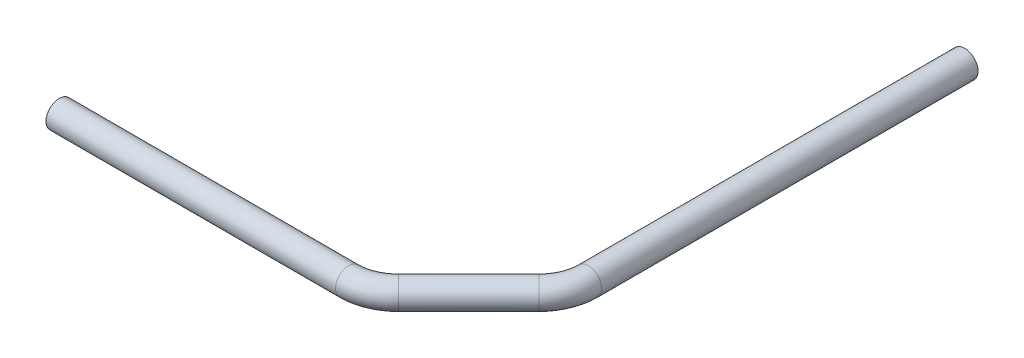
ISO-10303-21;
HEADER;
FILE_DESCRIPTION(('STEP AP214'),'2;1');
FILE_NAME('part.step','',(''),(''),'','','');
FILE_SCHEMA(('AUTOMOTIVE_DESIGN { 1 0 10303 214 1 1 1 1 }'));
ENDSEC;
DATA;
#1=APPLICATION_CONTEXT('core data for automotive mechanical design processes');
#2=APPLICATION_PROTOCOL_DEFINITION('international standard','automotive_design',2000,#1);
#3=PRODUCT_CONTEXT('',#1,'mechanical');
#4=PRODUCT('Part','Part','',(#3));
#5=PRODUCT_RELATED_PRODUCT_CATEGORY('part','',(#4));
#6=PRODUCT_DEFINITION_FORMATION('','',#4);
#7=PRODUCT_DEFINITION_CONTEXT('part definition',#1,'design');
#8=PRODUCT_DEFINITION('design','',#6,#7);
#9=PRODUCT_DEFINITION_SHAPE('','',#8);
#10=(LENGTH_UNIT() NAMED_UNIT(*) SI_UNIT(.MILLI.,.METRE.));
#11=(NAMED_UNIT(*) PLANE_ANGLE_UNIT() SI_UNIT($,.RADIAN.));
#12=(NAMED_UNIT(*) SI_UNIT($,.STERADIAN.) SOLID_ANGLE_UNIT());
#13=UNCERTAINTY_MEASURE_WITH_UNIT(LENGTH_MEASURE(1.E-05),#10,'distance_accuracy_value','');
#14=(GEOMETRIC_REPRESENTATION_CONTEXT(3) GLOBAL_UNCERTAINTY_ASSIGNED_CONTEXT((#13)) GLOBAL_UNIT_ASSIGNED_CONTEXT((#10,
#11,#12)) REPRESENTATION_CONTEXT('',''));
#15=CARTESIAN_POINT('',(0.,0.,0.));
#16=DIRECTION('',(0.,0.,1.));
#17=DIRECTION('',(1.,0.,0.));
#18=AXIS2_PLACEMENT_3D('',#15,#16,#17);
#19=CARTESIAN_POINT('',(0.,0.599999986588955,1.09999997541308));
#20=DIRECTION('',(1.,0.,0.));
#21=DIRECTION('',(0.,0.,-1.));
#22=AXIS2_PLACEMENT_3D('',#19,#20,#21);
#23=PLANE('',#22);
#24=CARTESIAN_POINT('',(0.,0.599999986588955,1.09999997541308));
#25=DIRECTION('',(1.,0.,0.));
#26=DIRECTION('',(0.,0.,-1.));
#27=AXIS2_PLACEMENT_3D('',#24,#25,#26);
#28=CIRCLE('',#27,0.535);
#29=CARTESIAN_POINT('',(0.,0.599999986588955,0.56499997541308));
#30=VERTEX_POINT('',#29);
#31=EDGE_CURVE('E17',#30,#30,#28,.T.);
#32=ORIENTED_EDGE('',*,*,#31,.F.);
#33=EDGE_LOOP('',(#32));
#34=FACE_BOUND('',#33,.T.);
#35=ADVANCED_FACE('F14',(#34),#23,.F.);
#36=CARTESIAN_POINT('',(0.,0.599999986588955,1.09999997541308));
#37=DIRECTION('',(1.,0.,0.));
#38=DIRECTION('',(0.,0.,-1.));
#39=AXIS2_PLACEMENT_3D('',#36,#37,#38);
#40=CYLINDRICAL_SURFACE('',#39,0.535);
#41=ORIENTED_EDGE('',*,*,#31,.T.);
#42=EDGE_LOOP('',(#41));
#43=FACE_BOUND('',#42,.T.);
#44=CARTESIAN_POINT('',(11.6715728752538,0.599999986588955,1.09999997541308));
#45=DIRECTION('',(1.,0.,0.));
#46=DIRECTION('',(0.,0.,1.));
#47=AXIS2_PLACEMENT_3D('',#44,#45,#46);
#48=CIRCLE('',#47,0.535);
#49=CARTESIAN_POINT('',(11.6715728752538,0.599999986588955,1.63499997541308));
#50=VERTEX_POINT('',#49);
#51=EDGE_CURVE('E58',#50,#50,#48,.T.);
#52=ORIENTED_EDGE('',*,*,#51,.F.);
#53=EDGE_LOOP('',(#52));
#54=FACE_BOUND('',#53,.T.);
#55=ADVANCED_FACE('F51',(#43,#54),#40,.T.);
#56=CARTESIAN_POINT('',(11.6715728752538,0.599999986588955,-0.900000024586916));
#57=DIRECTION('',(0.,1.,0.));
#58=DIRECTION('',(0.,0.,1.));
#59=AXIS2_PLACEMENT_3D('',#56,#57,#58);
#60=TOROIDAL_SURFACE('',#59,2.,0.535);
#61=ORIENTED_EDGE('',*,*,#51,.T.);
#62=EDGE_LOOP('',(#61));
#63=FACE_BOUND('',#62,.T.);
#64=CARTESIAN_POINT('',(13.0857864376269,0.599999986588955,0.51421353778618));
#65=DIRECTION('',(0.707106781186548,0.,-0.707106781186548));
#66=DIRECTION('',(-0.707106781186548,0.,-0.707106781186548));
#67=AXIS2_PLACEMENT_3D('',#64,#65,#66);
#68=CIRCLE('',#67,0.535);
#69=CARTESIAN_POINT('',(12.7074843096921,0.599999986588955,0.135911409851377));
#70=VERTEX_POINT('',#69);
#71=EDGE_CURVE('E61',#70,#70,#68,.T.);
#72=ORIENTED_EDGE('',*,*,#71,.F.);
#73=EDGE_LOOP('',(#72));
#74=FACE_BOUND('',#73,.T.);
#75=ADVANCED_FACE('F47',(#63,#74),#60,.T.);
#76=CARTESIAN_POINT('',(13.0857864376269,0.599999986588955,0.514213537786179));
#77=DIRECTION('',(0.707106781186548,0.,-0.707106781186548));
#78=DIRECTION('',(-0.707106781186548,0.,-0.707106781186548));
#79=AXIS2_PLACEMENT_3D('',#76,#77,#78);
#80=CYLINDRICAL_SURFACE('',#79,0.535);
#81=ORIENTED_EDGE('',*,*,#71,.T.);
#82=EDGE_LOOP('',(#81));
#83=FACE_BOUND('',#82,.T.);
#84=CARTESIAN_POINT('',(15.9142135623731,0.599999986588955,-2.31421358696001));
#85=DIRECTION('',(0.707106781186547,0.,-0.707106781186548));
#86=DIRECTION('',(0.707106781186548,0.,0.707106781186547));
#87=AXIS2_PLACEMENT_3D('',#84,#85,#86);
#88=CIRCLE('',#87,0.535);
#89=CARTESIAN_POINT('',(16.2925156903079,0.599999986588955,-1.93591145902521));
#90=VERTEX_POINT('',#89);
#91=EDGE_CURVE('E26',#90,#90,#88,.T.);
#92=ORIENTED_EDGE('',*,*,#91,.F.);
#93=EDGE_LOOP('',(#92));
#94=FACE_BOUND('',#93,.T.);
#95=ADVANCED_FACE('F43',(#83,#94),#80,.T.);
#96=CARTESIAN_POINT('',(16.5,0.599999986588955,-18.9000000245869));
#97=DIRECTION('',(0.,0.,-1.));
#98=DIRECTION('',(-1.,0.,0.));
#99=AXIS2_PLACEMENT_3D('',#96,#97,#98);
#100=PLANE('',#99);
#101=CARTESIAN_POINT('',(16.5,0.599999986588955,-18.9000000245869));
#102=DIRECTION('',(0.,0.,-1.));
#103=DIRECTION('',(-1.,0.,0.));
#104=AXIS2_PLACEMENT_3D('',#101,#102,#103);
#105=CIRCLE('',#104,0.535);
#106=CARTESIAN_POINT('',(15.965,0.599999986588955,-18.9000000245869));
#107=VERTEX_POINT('',#106);
#108=EDGE_CURVE('E21',#107,#107,#105,.F.);
#109=ORIENTED_EDGE('',*,*,#108,.F.);
#110=EDGE_LOOP('',(#109));
#111=FACE_BOUND('',#110,.T.);
#112=ADVANCED_FACE('F39',(#111),#100,.T.);
#113=CARTESIAN_POINT('',(14.5,0.599999986588955,-3.7284271493331));
#114=DIRECTION('',(0.,1.,0.));
#115=DIRECTION('',(0.,0.,1.));
#116=AXIS2_PLACEMENT_3D('',#113,#114,#115);
#117=TOROIDAL_SURFACE('',#116,1.99999999999999,0.535);
#118=ORIENTED_EDGE('',*,*,#91,.T.);
#119=EDGE_LOOP('',(#118));
#120=FACE_BOUND('',#119,.T.);
#121=CARTESIAN_POINT('',(16.5,0.599999986588955,-3.72842714933311));
#122=DIRECTION('',(0.,0.,-1.));
#123=DIRECTION('',(-1.,0.,0.));
#124=AXIS2_PLACEMENT_3D('',#121,#122,#123);
#125=CIRCLE('',#124,0.535);
#126=CARTESIAN_POINT('',(15.965,0.599999986588955,-3.72842714933311));
#127=VERTEX_POINT('',#126);
#128=EDGE_CURVE('E10',#127,#127,#125,.T.);
#129=ORIENTED_EDGE('',*,*,#128,.F.);
#130=EDGE_LOOP('',(#129));
#131=FACE_BOUND('',#130,.T.);
#132=ADVANCED_FACE('F34',(#120,#131),#117,.T.);
#133=CARTESIAN_POINT('',(16.5,0.599999986588955,-3.7284271493331));
#134=DIRECTION('',(0.,0.,-1.));
#135=DIRECTION('',(-1.,0.,0.));
#136=AXIS2_PLACEMENT_3D('',#133,#134,#135);
#137=CYLINDRICAL_SURFACE('',#136,0.535);
#138=ORIENTED_EDGE('',*,*,#128,.T.);
#139=EDGE_LOOP('',(#138));
#140=FACE_BOUND('',#139,.T.);
#141=ORIENTED_EDGE('',*,*,#108,.T.);
#142=EDGE_LOOP('',(#141));
#143=FACE_BOUND('',#142,.T.);
#144=ADVANCED_FACE('F38',(#140,#143),#137,.T.);
#145=CLOSED_SHELL('',(#35,#55,#75,#95,#112,#132,#144));
#146=MANIFOLD_SOLID_BREP('B1',#145);
#147=ADVANCED_BREP_SHAPE_REPRESENTATION('',(#18,#146),#14);
#148=SHAPE_DEFINITION_REPRESENTATION(#9,#147);
ENDSEC;
END-ISO-10303-21;
